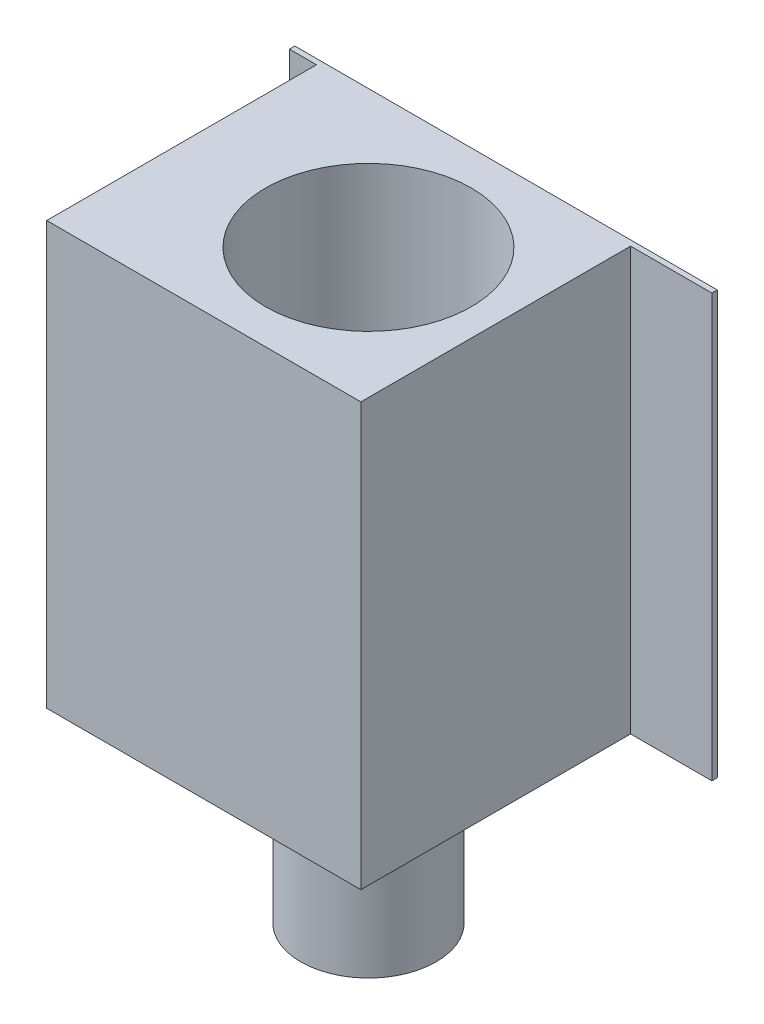
ISO-10303-21;
HEADER;
FILE_DESCRIPTION(('STEP AP214'),'2;1');
FILE_NAME('part.step','',(''),(''),'','','');
FILE_SCHEMA(('AUTOMOTIVE_DESIGN { 1 0 10303 214 1 1 1 1 }'));
ENDSEC;
DATA;
#1=APPLICATION_CONTEXT('core data for automotive mechanical design processes');
#2=APPLICATION_PROTOCOL_DEFINITION('international standard','automotive_design',2000,#1);
#3=PRODUCT_CONTEXT('',#1,'mechanical');
#4=PRODUCT('Part','Part','',(#3));
#5=PRODUCT_RELATED_PRODUCT_CATEGORY('part','',(#4));
#6=PRODUCT_DEFINITION_FORMATION('','',#4);
#7=PRODUCT_DEFINITION_CONTEXT('part definition',#1,'design');
#8=PRODUCT_DEFINITION('design','',#6,#7);
#9=PRODUCT_DEFINITION_SHAPE('','',#8);
#10=(LENGTH_UNIT() NAMED_UNIT(*) SI_UNIT(.MILLI.,.METRE.));
#11=(NAMED_UNIT(*) PLANE_ANGLE_UNIT() SI_UNIT($,.RADIAN.));
#12=(NAMED_UNIT(*) SI_UNIT($,.STERADIAN.) SOLID_ANGLE_UNIT());
#13=UNCERTAINTY_MEASURE_WITH_UNIT(LENGTH_MEASURE(1.E-05),#10,'distance_accuracy_value','');
#14=(GEOMETRIC_REPRESENTATION_CONTEXT(3) GLOBAL_UNCERTAINTY_ASSIGNED_CONTEXT((#13)) GLOBAL_UNIT_ASSIGNED_CONTEXT((#10,
#11,#12)) REPRESENTATION_CONTEXT('',''));
#15=CARTESIAN_POINT('',(0.,0.,0.));
#16=DIRECTION('',(0.,0.,1.));
#17=DIRECTION('',(1.,0.,0.));
#18=AXIS2_PLACEMENT_3D('',#15,#16,#17);
#19=CARTESIAN_POINT('',(-3.9,0.,-2.54));
#20=DIRECTION('',(0.,1.,0.));
#21=DIRECTION('',(0.,0.,1.));
#22=AXIS2_PLACEMENT_3D('',#19,#20,#21);
#23=PLANE('',#22);
#24=DIRECTION('',(-1.,0.,0.));
#25=VECTOR('',#24,1.);
#26=CARTESIAN_POINT('',(-3.9,0.,-2.44));
#27=LINE('',#26,#25);
#28=CARTESIAN_POINT('',(3.9,0.,-2.44));
#29=VERTEX_POINT('',#28);
#30=CARTESIAN_POINT('',(2.4,0.,-2.44));
#31=VERTEX_POINT('',#30);
#32=EDGE_CURVE('E148',#29,#31,#27,.T.);
#33=ORIENTED_EDGE('',*,*,#32,.T.);
#34=DIRECTION('',(0.,0.,1.));
#35=VECTOR('',#34,1.);
#36=CARTESIAN_POINT('',(2.4,0.,-2.54));
#37=LINE('',#36,#35);
#38=CARTESIAN_POINT('',(2.4,0.,2.54));
#39=VERTEX_POINT('',#38);
#40=EDGE_CURVE('E131',#31,#39,#37,.T.);
#41=ORIENTED_EDGE('',*,*,#40,.T.);
#42=DIRECTION('',(1.,0.,0.));
#43=VECTOR('',#42,1.);
#44=CARTESIAN_POINT('',(-3.9,0.,2.54));
#45=LINE('',#44,#43);
#46=CARTESIAN_POINT('',(-3.4,0.,2.54));
#47=VERTEX_POINT('',#46);
#48=EDGE_CURVE('E222',#47,#39,#45,.T.);
#49=ORIENTED_EDGE('',*,*,#48,.F.);
#50=DIRECTION('',(0.,0.,-1.));
#51=VECTOR('',#50,1.);
#52=CARTESIAN_POINT('',(-3.4,0.,-2.54));
#53=LINE('',#52,#51);
#54=CARTESIAN_POINT('',(-3.4,0.,-2.44));
#55=VERTEX_POINT('',#54);
#56=EDGE_CURVE('E159',#47,#55,#53,.T.);
#57=ORIENTED_EDGE('',*,*,#56,.T.);
#58=DIRECTION('',(-1.,0.,0.));
#59=VECTOR('',#58,1.);
#60=CARTESIAN_POINT('',(-3.9,0.,-2.44));
#61=LINE('',#60,#59);
#62=CARTESIAN_POINT('',(-3.9,0.,-2.44));
#63=VERTEX_POINT('',#62);
#64=EDGE_CURVE('E165',#55,#63,#61,.T.);
#65=ORIENTED_EDGE('',*,*,#64,.T.);
#66=DIRECTION('',(0.,0.,1.));
#67=VECTOR('',#66,1.);
#68=CARTESIAN_POINT('',(-3.9,0.,-2.54));
#69=LINE('',#68,#67);
#70=CARTESIAN_POINT('',(-3.9,0.,-2.54));
#71=VERTEX_POINT('',#70);
#72=EDGE_CURVE('E207',#71,#63,#69,.T.);
#73=ORIENTED_EDGE('',*,*,#72,.F.);
#74=DIRECTION('',(-1.,0.,0.));
#75=VECTOR('',#74,1.);
#76=CARTESIAN_POINT('',(-3.9,0.,-2.54));
#77=LINE('',#76,#75);
#78=CARTESIAN_POINT('',(3.9,0.,-2.54));
#79=VERTEX_POINT('',#78);
#80=EDGE_CURVE('E213',#79,#71,#77,.T.);
#81=ORIENTED_EDGE('',*,*,#80,.F.);
#82=DIRECTION('',(0.,0.,-1.));
#83=VECTOR('',#82,1.);
#84=CARTESIAN_POINT('',(3.9,0.,-2.54));
#85=LINE('',#84,#83);
#86=EDGE_CURVE('E225',#29,#79,#85,.T.);
#87=ORIENTED_EDGE('',*,*,#86,.F.);
#88=EDGE_LOOP('',(#33,#41,#49,#57,#65,#73,#81,#87));
#89=FACE_BOUND('',#88,.T.);
#90=CARTESIAN_POINT('',(0.,0.,0.));
#91=DIRECTION('',(0.,1.,0.));
#92=DIRECTION('',(0.,0.,1.));
#93=AXIS2_PLACEMENT_3D('',#90,#91,#92);
#94=CIRCLE('',#93,1.25);
#95=CARTESIAN_POINT('',(0.,0.,1.25));
#96=VERTEX_POINT('',#95);
#97=EDGE_CURVE('E11',#96,#96,#94,.F.);
#98=ORIENTED_EDGE('',*,*,#97,.F.);
#99=EDGE_LOOP('',(#98));
#100=FACE_BOUND('',#99,.T.);
#101=ADVANCED_FACE('F35',(#89,#100),#23,.F.);
#102=CARTESIAN_POINT('',(-3.9,7.8,-2.54));
#103=DIRECTION('',(1.,0.,0.));
#104=DIRECTION('',(0.,0.,-1.));
#105=AXIS2_PLACEMENT_3D('',#102,#103,#104);
#106=PLANE('',#105);
#107=ORIENTED_EDGE('',*,*,#72,.T.);
#108=DIRECTION('',(0.,1.,0.));
#109=VECTOR('',#108,1.);
#110=CARTESIAN_POINT('',(-3.9,-3.,-2.44));
#111=LINE('',#110,#109);
#112=CARTESIAN_POINT('',(-3.9,7.8,-2.44));
#113=VERTEX_POINT('',#112);
#114=EDGE_CURVE('E156',#63,#113,#111,.T.);
#115=ORIENTED_EDGE('',*,*,#114,.T.);
#116=DIRECTION('',(0.,0.,1.));
#117=VECTOR('',#116,1.);
#118=CARTESIAN_POINT('',(-3.9,7.8,-2.54));
#119=LINE('',#118,#117);
#120=CARTESIAN_POINT('',(-3.9,7.8,-2.54));
#121=VERTEX_POINT('',#120);
#122=EDGE_CURVE('E210',#121,#113,#119,.T.);
#123=ORIENTED_EDGE('',*,*,#122,.F.);
#124=DIRECTION('',(0.,-1.,0.));
#125=VECTOR('',#124,1.);
#126=CARTESIAN_POINT('',(-3.9,7.8,-2.54));
#127=LINE('',#126,#125);
#128=EDGE_CURVE('E219',#121,#71,#127,.T.);
#129=ORIENTED_EDGE('',*,*,#128,.T.);
#130=EDGE_LOOP('',(#107,#115,#123,#129));
#131=FACE_BOUND('',#130,.T.);
#132=ADVANCED_FACE('F37',(#131),#106,.F.);
#133=CARTESIAN_POINT('',(-3.9,7.8,2.54));
#134=DIRECTION('',(0.,0.,-1.));
#135=DIRECTION('',(-1.,0.,0.));
#136=AXIS2_PLACEMENT_3D('',#133,#134,#135);
#137=PLANE('',#136);
#138=ORIENTED_EDGE('',*,*,#48,.T.);
#139=DIRECTION('',(0.,1.,0.));
#140=VECTOR('',#139,1.);
#141=CARTESIAN_POINT('',(2.4,-3.,2.54));
#142=LINE('',#141,#140);
#143=CARTESIAN_POINT('',(2.4,7.8,2.54));
#144=VERTEX_POINT('',#143);
#145=EDGE_CURVE('E133',#39,#144,#142,.T.);
#146=ORIENTED_EDGE('',*,*,#145,.T.);
#147=DIRECTION('',(1.,0.,0.));
#148=VECTOR('',#147,1.);
#149=CARTESIAN_POINT('',(-3.9,7.8,2.54));
#150=LINE('',#149,#148);
#151=CARTESIAN_POINT('',(-3.4,7.8,2.54));
#152=VERTEX_POINT('',#151);
#153=EDGE_CURVE('E144',#152,#144,#150,.T.);
#154=ORIENTED_EDGE('',*,*,#153,.F.);
#155=DIRECTION('',(0.,1.,0.));
#156=VECTOR('',#155,1.);
#157=CARTESIAN_POINT('',(-3.4,-3.,2.54));
#158=LINE('',#157,#156);
#159=EDGE_CURVE('E58',#47,#152,#158,.T.);
#160=ORIENTED_EDGE('',*,*,#159,.F.);
#161=EDGE_LOOP('',(#138,#146,#154,#160));
#162=FACE_BOUND('',#161,.T.);
#163=ADVANCED_FACE('F246',(#162),#137,.F.);
#164=CARTESIAN_POINT('',(3.9,7.8,-2.54));
#165=DIRECTION('',(-1.,0.,0.));
#166=DIRECTION('',(0.,0.,1.));
#167=AXIS2_PLACEMENT_3D('',#164,#165,#166);
#168=PLANE('',#167);
#169=DIRECTION('',(0.,0.,-1.));
#170=VECTOR('',#169,1.);
#171=CARTESIAN_POINT('',(3.9,7.8,-2.54));
#172=LINE('',#171,#170);
#173=CARTESIAN_POINT('',(3.9,7.8,-2.44));
#174=VERTEX_POINT('',#173);
#175=CARTESIAN_POINT('',(3.9,7.8,-2.54));
#176=VERTEX_POINT('',#175);
#177=EDGE_CURVE('E215',#174,#176,#172,.T.);
#178=ORIENTED_EDGE('',*,*,#177,.F.);
#179=DIRECTION('',(0.,1.,0.));
#180=VECTOR('',#179,1.);
#181=CARTESIAN_POINT('',(3.9,-3.,-2.44));
#182=LINE('',#181,#180);
#183=EDGE_CURVE('E50',#29,#174,#182,.T.);
#184=ORIENTED_EDGE('',*,*,#183,.F.);
#185=ORIENTED_EDGE('',*,*,#86,.T.);
#186=DIRECTION('',(0.,-1.,0.));
#187=VECTOR('',#186,1.);
#188=CARTESIAN_POINT('',(3.9,7.8,-2.54));
#189=LINE('',#188,#187);
#190=EDGE_CURVE('E43',#176,#79,#189,.T.);
#191=ORIENTED_EDGE('',*,*,#190,.F.);
#192=EDGE_LOOP('',(#178,#184,#185,#191));
#193=FACE_BOUND('',#192,.T.);
#194=ADVANCED_FACE('F244',(#193),#168,.F.);
#195=CARTESIAN_POINT('',(-3.9,7.8,-2.54));
#196=DIRECTION('',(0.,0.,1.));
#197=DIRECTION('',(1.,0.,0.));
#198=AXIS2_PLACEMENT_3D('',#195,#196,#197);
#199=PLANE('',#198);
#200=ORIENTED_EDGE('',*,*,#80,.T.);
#201=ORIENTED_EDGE('',*,*,#128,.F.);
#202=DIRECTION('',(-1.,0.,0.));
#203=VECTOR('',#202,1.);
#204=CARTESIAN_POINT('',(-3.9,7.8,-2.54));
#205=LINE('',#204,#203);
#206=EDGE_CURVE('E217',#176,#121,#205,.T.);
#207=ORIENTED_EDGE('',*,*,#206,.F.);
#208=ORIENTED_EDGE('',*,*,#190,.T.);
#209=EDGE_LOOP('',(#200,#201,#207,#208));
#210=FACE_BOUND('',#209,.T.);
#211=ADVANCED_FACE('F234',(#210),#199,.F.);
#212=CARTESIAN_POINT('',(-3.9,7.8,-2.54));
#213=DIRECTION('',(0.,1.,0.));
#214=DIRECTION('',(0.,0.,1.));
#215=AXIS2_PLACEMENT_3D('',#212,#213,#214);
#216=PLANE('',#215);
#217=DIRECTION('',(0.,0.,1.));
#218=VECTOR('',#217,1.);
#219=CARTESIAN_POINT('',(2.4,7.8,2.54));
#220=LINE('',#219,#218);
#221=CARTESIAN_POINT('',(2.4,7.8,-2.44));
#222=VERTEX_POINT('',#221);
#223=EDGE_CURVE('E128',#222,#144,#220,.T.);
#224=ORIENTED_EDGE('',*,*,#223,.F.);
#225=DIRECTION('',(-1.,0.,0.));
#226=VECTOR('',#225,1.);
#227=CARTESIAN_POINT('',(3.9,7.8,-2.44));
#228=LINE('',#227,#226);
#229=EDGE_CURVE('E135',#174,#222,#228,.T.);
#230=ORIENTED_EDGE('',*,*,#229,.F.);
#231=ORIENTED_EDGE('',*,*,#177,.T.);
#232=ORIENTED_EDGE('',*,*,#206,.T.);
#233=ORIENTED_EDGE('',*,*,#122,.T.);
#234=DIRECTION('',(-1.,0.,0.));
#235=VECTOR('',#234,1.);
#236=CARTESIAN_POINT('',(-3.9,7.8,-2.44));
#237=LINE('',#236,#235);
#238=CARTESIAN_POINT('',(-3.4,7.8,-2.44));
#239=VERTEX_POINT('',#238);
#240=EDGE_CURVE('E154',#239,#113,#237,.T.);
#241=ORIENTED_EDGE('',*,*,#240,.F.);
#242=DIRECTION('',(0.,0.,-1.));
#243=VECTOR('',#242,1.);
#244=CARTESIAN_POINT('',(-3.4,7.8,-2.44));
#245=LINE('',#244,#243);
#246=EDGE_CURVE('E152',#152,#239,#245,.T.);
#247=ORIENTED_EDGE('',*,*,#246,.F.);
#248=ORIENTED_EDGE('',*,*,#153,.T.);
#249=EDGE_LOOP('',(#224,#230,#231,#232,#233,#241,#247,#248));
#250=FACE_BOUND('',#249,.T.);
#251=CARTESIAN_POINT('',(0.,7.8,0.));
#252=DIRECTION('',(0.,1.,0.));
#253=DIRECTION('',(0.,0.,1.));
#254=AXIS2_PLACEMENT_3D('',#251,#252,#253);
#255=CIRCLE('',#254,1.9);
#256=CARTESIAN_POINT('',(0.,7.8,1.9));
#257=VERTEX_POINT('',#256);
#258=EDGE_CURVE('E197',#257,#257,#255,.T.);
#259=ORIENTED_EDGE('',*,*,#258,.F.);
#260=EDGE_LOOP('',(#259));
#261=FACE_BOUND('',#260,.T.);
#262=ADVANCED_FACE('F141',(#250,#261),#216,.T.);
#263=CARTESIAN_POINT('',(0.,3.6,0.));
#264=DIRECTION('',(0.,1.,0.));
#265=DIRECTION('',(0.,0.,1.));
#266=AXIS2_PLACEMENT_3D('',#263,#264,#265);
#267=CYLINDRICAL_SURFACE('',#266,1.9);
#268=CARTESIAN_POINT('',(0.,3.6,0.));
#269=DIRECTION('',(0.,1.,0.));
#270=DIRECTION('',(0.,0.,1.));
#271=AXIS2_PLACEMENT_3D('',#268,#269,#270);
#272=CIRCLE('',#271,1.9);
#273=CARTESIAN_POINT('',(0.,3.6,1.9));
#274=VERTEX_POINT('',#273);
#275=EDGE_CURVE('E204',#274,#274,#272,.T.);
#276=ORIENTED_EDGE('',*,*,#275,.F.);
#277=EDGE_LOOP('',(#276));
#278=FACE_BOUND('',#277,.T.);
#279=ORIENTED_EDGE('',*,*,#258,.T.);
#280=EDGE_LOOP('',(#279));
#281=FACE_BOUND('',#280,.T.);
#282=ADVANCED_FACE('F262',(#278,#281),#267,.F.);
#283=CARTESIAN_POINT('',(0.,3.6,0.));
#284=DIRECTION('',(0.,1.,0.));
#285=DIRECTION('',(0.,0.,1.));
#286=AXIS2_PLACEMENT_3D('',#283,#284,#285);
#287=PLANE('',#286);
#288=DIRECTION('',(0.,0.,1.));
#289=VECTOR('',#288,1.);
#290=CARTESIAN_POINT('',(-1.25452919093157,3.6,-0.307477326621694));
#291=LINE('',#290,#289);
#292=CARTESIAN_POINT('',(-1.25452919093157,3.6,-0.307477326621694));
#293=VERTEX_POINT('',#292);
#294=CARTESIAN_POINT('',(-1.25452919093157,3.6,0.307477326621694));
#295=VERTEX_POINT('',#294);
#296=EDGE_CURVE('E171',#293,#295,#291,.T.);
#297=ORIENTED_EDGE('',*,*,#296,.F.);
#298=DIRECTION('',(-1.,0.,0.));
#299=VECTOR('',#298,1.);
#300=CARTESIAN_POINT('',(-1.25452919093157,3.6,-0.307477326621694));
#301=LINE('',#300,#299);
#302=CARTESIAN_POINT('',(1.25452919093157,3.6,-0.307477326621694));
#303=VERTEX_POINT('',#302);
#304=EDGE_CURVE('E176',#303,#293,#301,.T.);
#305=ORIENTED_EDGE('',*,*,#304,.F.);
#306=DIRECTION('',(0.,0.,-1.));
#307=VECTOR('',#306,1.);
#308=CARTESIAN_POINT('',(1.25452919093157,3.6,-0.307477326621694));
#309=LINE('',#308,#307);
#310=CARTESIAN_POINT('',(1.25452919093157,3.6,0.307477326621693));
#311=VERTEX_POINT('',#310);
#312=EDGE_CURVE('E190',#311,#303,#309,.T.);
#313=ORIENTED_EDGE('',*,*,#312,.F.);
#314=DIRECTION('',(1.,0.,0.));
#315=VECTOR('',#314,1.);
#316=CARTESIAN_POINT('',(-1.25452919093157,3.6,0.307477326621694));
#317=LINE('',#316,#315);
#318=EDGE_CURVE('E187',#295,#311,#317,.T.);
#319=ORIENTED_EDGE('',*,*,#318,.F.);
#320=EDGE_LOOP('',(#297,#305,#313,#319));
#321=FACE_BOUND('',#320,.T.);
#322=ORIENTED_EDGE('',*,*,#275,.T.);
#323=EDGE_LOOP('',(#322));
#324=FACE_BOUND('',#323,.T.);
#325=ADVANCED_FACE('F265',(#321,#324),#287,.T.);
#326=CARTESIAN_POINT('',(-1.25452919093157,3.1,-0.307477326621694));
#327=DIRECTION('',(-1.,0.,0.));
#328=DIRECTION('',(0.,0.,1.));
#329=AXIS2_PLACEMENT_3D('',#326,#327,#328);
#330=PLANE('',#329);
#331=ORIENTED_EDGE('',*,*,#296,.T.);
#332=DIRECTION('',(0.,1.,0.));
#333=VECTOR('',#332,1.);
#334=CARTESIAN_POINT('',(-1.25452919093157,3.1,0.307477326621694));
#335=LINE('',#334,#333);
#336=CARTESIAN_POINT('',(-1.25452919093157,3.1,0.307477326621694));
#337=VERTEX_POINT('',#336);
#338=EDGE_CURVE('E185',#337,#295,#335,.T.);
#339=ORIENTED_EDGE('',*,*,#338,.F.);
#340=DIRECTION('',(0.,0.,1.));
#341=VECTOR('',#340,1.);
#342=CARTESIAN_POINT('',(-1.25452919093157,3.1,-0.307477326621694));
#343=LINE('',#342,#341);
#344=CARTESIAN_POINT('',(-1.25452919093157,3.1,-0.307477326621694));
#345=VERTEX_POINT('',#344);
#346=EDGE_CURVE('E172',#345,#337,#343,.T.);
#347=ORIENTED_EDGE('',*,*,#346,.F.);
#348=DIRECTION('',(0.,1.,0.));
#349=VECTOR('',#348,1.);
#350=CARTESIAN_POINT('',(-1.25452919093157,3.1,-0.307477326621694));
#351=LINE('',#350,#349);
#352=EDGE_CURVE('E195',#345,#293,#351,.T.);
#353=ORIENTED_EDGE('',*,*,#352,.T.);
#354=EDGE_LOOP('',(#331,#339,#347,#353));
#355=FACE_BOUND('',#354,.T.);
#356=ADVANCED_FACE('F269',(#355),#330,.F.);
#357=CARTESIAN_POINT('',(-1.25452919093157,3.1,-0.307477326621694));
#358=DIRECTION('',(0.,0.,-1.));
#359=DIRECTION('',(-1.,0.,0.));
#360=AXIS2_PLACEMENT_3D('',#357,#358,#359);
#361=PLANE('',#360);
#362=ORIENTED_EDGE('',*,*,#304,.T.);
#363=ORIENTED_EDGE('',*,*,#352,.F.);
#364=DIRECTION('',(-1.,0.,0.));
#365=VECTOR('',#364,1.);
#366=CARTESIAN_POINT('',(-1.25452919093157,3.1,-0.307477326621694));
#367=LINE('',#366,#365);
#368=CARTESIAN_POINT('',(1.25452919093157,3.1,-0.307477326621694));
#369=VERTEX_POINT('',#368);
#370=EDGE_CURVE('E182',#369,#345,#367,.T.);
#371=ORIENTED_EDGE('',*,*,#370,.F.);
#372=DIRECTION('',(0.,1.,0.));
#373=VECTOR('',#372,1.);
#374=CARTESIAN_POINT('',(1.25452919093157,3.1,-0.307477326621694));
#375=LINE('',#374,#373);
#376=EDGE_CURVE('E198',#369,#303,#375,.T.);
#377=ORIENTED_EDGE('',*,*,#376,.T.);
#378=EDGE_LOOP('',(#362,#363,#371,#377));
#379=FACE_BOUND('',#378,.T.);
#380=ADVANCED_FACE('F273',(#379),#361,.F.);
#381=CARTESIAN_POINT('',(1.25452919093157,3.1,-0.307477326621694));
#382=DIRECTION('',(1.,0.,0.));
#383=DIRECTION('',(0.,0.,-1.));
#384=AXIS2_PLACEMENT_3D('',#381,#382,#383);
#385=PLANE('',#384);
#386=ORIENTED_EDGE('',*,*,#312,.T.);
#387=ORIENTED_EDGE('',*,*,#376,.F.);
#388=DIRECTION('',(0.,0.,-1.));
#389=VECTOR('',#388,1.);
#390=CARTESIAN_POINT('',(1.25452919093157,3.1,-0.307477326621694));
#391=LINE('',#390,#389);
#392=CARTESIAN_POINT('',(1.25452919093157,3.1,0.307477326621693));
#393=VERTEX_POINT('',#392);
#394=EDGE_CURVE('E179',#393,#369,#391,.T.);
#395=ORIENTED_EDGE('',*,*,#394,.F.);
#396=DIRECTION('',(0.,1.,0.));
#397=VECTOR('',#396,1.);
#398=CARTESIAN_POINT('',(1.25452919093157,3.1,0.307477326621693));
#399=LINE('',#398,#397);
#400=EDGE_CURVE('E200',#393,#311,#399,.T.);
#401=ORIENTED_EDGE('',*,*,#400,.T.);
#402=EDGE_LOOP('',(#386,#387,#395,#401));
#403=FACE_BOUND('',#402,.T.);
#404=ADVANCED_FACE('F279',(#403),#385,.F.);
#405=CARTESIAN_POINT('',(-1.25452919093157,3.1,0.307477326621694));
#406=DIRECTION('',(0.,0.,1.));
#407=DIRECTION('',(1.,0.,0.));
#408=AXIS2_PLACEMENT_3D('',#405,#406,#407);
#409=PLANE('',#408);
#410=ORIENTED_EDGE('',*,*,#318,.T.);
#411=ORIENTED_EDGE('',*,*,#400,.F.);
#412=DIRECTION('',(1.,0.,0.));
#413=VECTOR('',#412,1.);
#414=CARTESIAN_POINT('',(-1.25452919093157,3.1,0.307477326621694));
#415=LINE('',#414,#413);
#416=EDGE_CURVE('E175',#337,#393,#415,.T.);
#417=ORIENTED_EDGE('',*,*,#416,.F.);
#418=ORIENTED_EDGE('',*,*,#338,.T.);
#419=EDGE_LOOP('',(#410,#411,#417,#418));
#420=FACE_BOUND('',#419,.T.);
#421=ADVANCED_FACE('F275',(#420),#409,.F.);
#422=CARTESIAN_POINT('',(0.,3.1,0.));
#423=DIRECTION('',(0.,1.,0.));
#424=DIRECTION('',(0.,0.,1.));
#425=AXIS2_PLACEMENT_3D('',#422,#423,#424);
#426=PLANE('',#425);
#427=ORIENTED_EDGE('',*,*,#346,.T.);
#428=ORIENTED_EDGE('',*,*,#416,.T.);
#429=ORIENTED_EDGE('',*,*,#394,.T.);
#430=ORIENTED_EDGE('',*,*,#370,.T.);
#431=EDGE_LOOP('',(#427,#428,#429,#430));
#432=FACE_BOUND('',#431,.T.);
#433=ADVANCED_FACE('F278',(#432),#426,.T.);
#434=CARTESIAN_POINT('',(0.,-3.,0.));
#435=DIRECTION('',(0.,1.,0.));
#436=DIRECTION('',(0.,0.,1.));
#437=AXIS2_PLACEMENT_3D('',#434,#435,#436);
#438=CYLINDRICAL_SURFACE('',#437,1.25);
#439=CARTESIAN_POINT('',(0.,-3.,0.));
#440=DIRECTION('',(0.,-1.,0.));
#441=DIRECTION('',(0.,0.,-1.));
#442=AXIS2_PLACEMENT_3D('',#439,#440,#441);
#443=CIRCLE('',#442,1.25);
#444=CARTESIAN_POINT('',(0.,-3.,-1.25));
#445=VERTEX_POINT('',#444);
#446=EDGE_CURVE('E168',#445,#445,#443,.T.);
#447=ORIENTED_EDGE('',*,*,#446,.F.);
#448=EDGE_LOOP('',(#447));
#449=FACE_BOUND('',#448,.T.);
#450=ORIENTED_EDGE('',*,*,#97,.T.);
#451=EDGE_LOOP('',(#450));
#452=FACE_BOUND('',#451,.T.);
#453=ADVANCED_FACE('F289',(#449,#452),#438,.T.);
#454=CARTESIAN_POINT('',(0.,-3.,0.));
#455=DIRECTION('',(0.,-1.,0.));
#456=DIRECTION('',(0.,0.,-1.));
#457=AXIS2_PLACEMENT_3D('',#454,#455,#456);
#458=PLANE('',#457);
#459=ORIENTED_EDGE('',*,*,#446,.T.);
#460=EDGE_LOOP('',(#459));
#461=FACE_BOUND('',#460,.T.);
#462=ADVANCED_FACE('F293',(#461),#458,.T.);
#463=CARTESIAN_POINT('',(-3.9,-3.,-2.44));
#464=DIRECTION('',(0.,0.,-1.));
#465=DIRECTION('',(-1.,0.,0.));
#466=AXIS2_PLACEMENT_3D('',#463,#464,#465);
#467=PLANE('',#466);
#468=DIRECTION('',(0.,1.,0.));
#469=VECTOR('',#468,1.);
#470=CARTESIAN_POINT('',(-3.4,-3.,-2.44));
#471=LINE('',#470,#469);
#472=EDGE_CURVE('E160',#55,#239,#471,.T.);
#473=ORIENTED_EDGE('',*,*,#472,.T.);
#474=ORIENTED_EDGE('',*,*,#240,.T.);
#475=ORIENTED_EDGE('',*,*,#114,.F.);
#476=ORIENTED_EDGE('',*,*,#64,.F.);
#477=EDGE_LOOP('',(#473,#474,#475,#476));
#478=FACE_BOUND('',#477,.T.);
#479=ADVANCED_FACE('F297',(#478),#467,.F.);
#480=CARTESIAN_POINT('',(-3.4,-3.,-2.44));
#481=DIRECTION('',(1.,0.,0.));
#482=DIRECTION('',(0.,0.,-1.));
#483=AXIS2_PLACEMENT_3D('',#480,#481,#482);
#484=PLANE('',#483);
#485=ORIENTED_EDGE('',*,*,#159,.T.);
#486=ORIENTED_EDGE('',*,*,#246,.T.);
#487=ORIENTED_EDGE('',*,*,#472,.F.);
#488=ORIENTED_EDGE('',*,*,#56,.F.);
#489=EDGE_LOOP('',(#485,#486,#487,#488));
#490=FACE_BOUND('',#489,.T.);
#491=ADVANCED_FACE('F299',(#490),#484,.F.);
#492=CARTESIAN_POINT('',(2.4,-3.,2.54));
#493=DIRECTION('',(-1.,0.,0.));
#494=DIRECTION('',(0.,0.,1.));
#495=AXIS2_PLACEMENT_3D('',#492,#493,#494);
#496=PLANE('',#495);
#497=DIRECTION('',(0.,1.,0.));
#498=VECTOR('',#497,1.);
#499=CARTESIAN_POINT('',(2.4,-3.,-2.44));
#500=LINE('',#499,#498);
#501=EDGE_CURVE('E125',#31,#222,#500,.T.);
#502=ORIENTED_EDGE('',*,*,#501,.T.);
#503=ORIENTED_EDGE('',*,*,#223,.T.);
#504=ORIENTED_EDGE('',*,*,#145,.F.);
#505=ORIENTED_EDGE('',*,*,#40,.F.);
#506=EDGE_LOOP('',(#502,#503,#504,#505));
#507=FACE_BOUND('',#506,.T.);
#508=ADVANCED_FACE('F126',(#507),#496,.F.);
#509=CARTESIAN_POINT('',(3.9,-3.,-2.44));
#510=DIRECTION('',(0.,0.,-1.));
#511=DIRECTION('',(-1.,0.,0.));
#512=AXIS2_PLACEMENT_3D('',#509,#510,#511);
#513=PLANE('',#512);
#514=ORIENTED_EDGE('',*,*,#183,.T.);
#515=ORIENTED_EDGE('',*,*,#229,.T.);
#516=ORIENTED_EDGE('',*,*,#501,.F.);
#517=ORIENTED_EDGE('',*,*,#32,.F.);
#518=EDGE_LOOP('',(#514,#515,#516,#517));
#519=FACE_BOUND('',#518,.T.);
#520=ADVANCED_FACE('F136',(#519),#513,.F.);
#521=CLOSED_SHELL('',(#101,#132,#163,#194,#211,#262,#282,#325,#356,#380,#404,#421,#433,#453,
#462,#479,#491,#508,#520));
#522=MANIFOLD_SOLID_BREP('B2',#521);
#523=ADVANCED_BREP_SHAPE_REPRESENTATION('',(#18,#522),#14);
#524=SHAPE_DEFINITION_REPRESENTATION(#9,#523);
ENDSEC;
END-ISO-10303-21;
